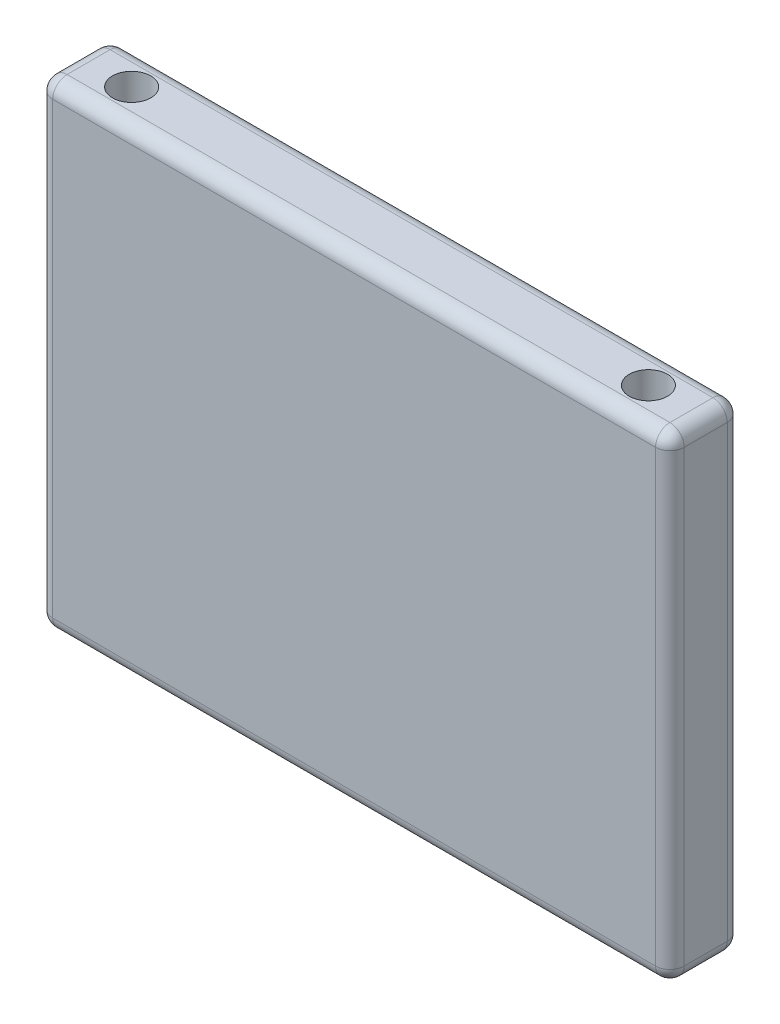
ISO-10303-21;
HEADER;
FILE_DESCRIPTION(('STEP AP214'),'2;1');
FILE_NAME('part.step','',(''),(''),'','','');
FILE_SCHEMA(('AUTOMOTIVE_DESIGN { 1 0 10303 214 1 1 1 1 }'));
ENDSEC;
DATA;
#1=APPLICATION_CONTEXT('core data for automotive mechanical design processes');
#2=APPLICATION_PROTOCOL_DEFINITION('international standard','automotive_design',2000,#1);
#3=PRODUCT_CONTEXT('',#1,'mechanical');
#4=PRODUCT('Part','Part','',(#3));
#5=PRODUCT_RELATED_PRODUCT_CATEGORY('part','',(#4));
#6=PRODUCT_DEFINITION_FORMATION('','',#4);
#7=PRODUCT_DEFINITION_CONTEXT('part definition',#1,'design');
#8=PRODUCT_DEFINITION('design','',#6,#7);
#9=PRODUCT_DEFINITION_SHAPE('','',#8);
#10=(LENGTH_UNIT() NAMED_UNIT(*) SI_UNIT(.MILLI.,.METRE.));
#11=(NAMED_UNIT(*) PLANE_ANGLE_UNIT() SI_UNIT($,.RADIAN.));
#12=(NAMED_UNIT(*) SI_UNIT($,.STERADIAN.) SOLID_ANGLE_UNIT());
#13=UNCERTAINTY_MEASURE_WITH_UNIT(LENGTH_MEASURE(1.E-05),#10,'distance_accuracy_value','');
#14=(GEOMETRIC_REPRESENTATION_CONTEXT(3) GLOBAL_UNCERTAINTY_ASSIGNED_CONTEXT((#13)) GLOBAL_UNIT_ASSIGNED_CONTEXT((#10,
#11,#12)) REPRESENTATION_CONTEXT('',''));
#15=CARTESIAN_POINT('',(0.,0.,0.));
#16=DIRECTION('',(0.,0.,1.));
#17=DIRECTION('',(1.,0.,0.));
#18=AXIS2_PLACEMENT_3D('',#15,#16,#17);
#19=CARTESIAN_POINT('',(66.0660660660661,50.,15.));
#20=DIRECTION('',(-1.,0.,0.));
#21=DIRECTION('',(0.,0.,1.));
#22=AXIS2_PLACEMENT_3D('',#19,#20,#21);
#23=PLANE('',#22);
#24=DIRECTION('',(0.,1.,0.));
#25=VECTOR('',#24,1.);
#26=CARTESIAN_POINT('',(66.0660660660661,50.,3.));
#27=LINE('',#26,#25);
#28=CARTESIAN_POINT('',(66.0660660660661,-47.,3.));
#29=VERTEX_POINT('',#28);
#30=CARTESIAN_POINT('',(66.0660660660661,47.,3.));
#31=VERTEX_POINT('',#30);
#32=EDGE_CURVE('E307',#29,#31,#27,.T.);
#33=ORIENTED_EDGE('',*,*,#32,.T.);
#34=DIRECTION('',(0.,0.,-1.));
#35=VECTOR('',#34,1.);
#36=CARTESIAN_POINT('',(66.0660660660661,47.,15.));
#37=LINE('',#36,#35);
#38=CARTESIAN_POINT('',(66.0660660660661,47.,12.));
#39=VERTEX_POINT('',#38);
#40=EDGE_CURVE('E310',#31,#39,#37,.F.);
#41=ORIENTED_EDGE('',*,*,#40,.T.);
#42=DIRECTION('',(0.,1.,0.));
#43=VECTOR('',#42,1.);
#44=CARTESIAN_POINT('',(66.0660660660661,-50.,12.));
#45=LINE('',#44,#43);
#46=CARTESIAN_POINT('',(66.0660660660661,-47.,12.));
#47=VERTEX_POINT('',#46);
#48=EDGE_CURVE('E301',#39,#47,#45,.F.);
#49=ORIENTED_EDGE('',*,*,#48,.T.);
#50=DIRECTION('',(0.,0.,-1.));
#51=VECTOR('',#50,1.);
#52=CARTESIAN_POINT('',(66.0660660660661,-47.,15.));
#53=LINE('',#52,#51);
#54=EDGE_CURVE('E304',#47,#29,#53,.T.);
#55=ORIENTED_EDGE('',*,*,#54,.T.);
#56=EDGE_LOOP('',(#33,#41,#49,#55));
#57=FACE_BOUND('',#56,.T.);
#58=ADVANCED_FACE('F38',(#57),#23,.F.);
#59=CARTESIAN_POINT('',(-66.0660660660661,50.,15.));
#60=DIRECTION('',(0.,-1.,0.));
#61=DIRECTION('',(0.,0.,-1.));
#62=AXIS2_PLACEMENT_3D('',#59,#60,#61);
#63=PLANE('',#62);
#64=DIRECTION('',(-1.,0.,0.));
#65=VECTOR('',#64,1.);
#66=CARTESIAN_POINT('',(-66.0660660660661,50.,3.));
#67=LINE('',#66,#65);
#68=CARTESIAN_POINT('',(63.0660660660661,50.,3.));
#69=VERTEX_POINT('',#68);
#70=CARTESIAN_POINT('',(-63.0660660660661,50.,3.));
#71=VERTEX_POINT('',#70);
#72=EDGE_CURVE('E269',#69,#71,#67,.T.);
#73=ORIENTED_EDGE('',*,*,#72,.T.);
#74=DIRECTION('',(0.,0.,-1.));
#75=VECTOR('',#74,1.);
#76=CARTESIAN_POINT('',(-63.0660660660661,50.,15.));
#77=LINE('',#76,#75);
#78=CARTESIAN_POINT('',(-63.0660660660661,50.,12.));
#79=VERTEX_POINT('',#78);
#80=EDGE_CURVE('E272',#71,#79,#77,.F.);
#81=ORIENTED_EDGE('',*,*,#80,.T.);
#82=DIRECTION('',(-1.,0.,0.));
#83=VECTOR('',#82,1.);
#84=CARTESIAN_POINT('',(66.0660660660661,50.,12.));
#85=LINE('',#84,#83);
#86=CARTESIAN_POINT('',(63.0660660660661,50.,12.));
#87=VERTEX_POINT('',#86);
#88=EDGE_CURVE('E266',#79,#87,#85,.F.);
#89=ORIENTED_EDGE('',*,*,#88,.T.);
#90=DIRECTION('',(0.,0.,-1.));
#91=VECTOR('',#90,1.);
#92=CARTESIAN_POINT('',(63.0660660660661,50.,15.));
#93=LINE('',#92,#91);
#94=EDGE_CURVE('E263',#87,#69,#93,.T.);
#95=ORIENTED_EDGE('',*,*,#94,.T.);
#96=EDGE_LOOP('',(#73,#81,#89,#95));
#97=FACE_BOUND('',#96,.T.);
#98=CARTESIAN_POINT('',(-54.0660660660661,50.,7.5));
#99=DIRECTION('',(0.,-1.,0.));
#100=DIRECTION('',(0.,0.,-1.));
#101=AXIS2_PLACEMENT_3D('',#98,#99,#100);
#102=CIRCLE('',#101,4.00000000000001);
#103=CARTESIAN_POINT('',(-54.0660660660661,50.,3.49999999999999));
#104=VERTEX_POINT('',#103);
#105=EDGE_CURVE('E239',#104,#104,#102,.T.);
#106=ORIENTED_EDGE('',*,*,#105,.T.);
#107=EDGE_LOOP('',(#106));
#108=FACE_BOUND('',#107,.T.);
#109=CARTESIAN_POINT('',(54.0660660660661,50.,7.5));
#110=DIRECTION('',(0.,-1.,0.));
#111=DIRECTION('',(0.,0.,1.));
#112=AXIS2_PLACEMENT_3D('',#109,#110,#111);
#113=CIRCLE('',#112,4.00000000000001);
#114=CARTESIAN_POINT('',(54.0660660660661,50.,11.5));
#115=VERTEX_POINT('',#114);
#116=EDGE_CURVE('E226',#115,#115,#113,.T.);
#117=ORIENTED_EDGE('',*,*,#116,.T.);
#118=EDGE_LOOP('',(#117));
#119=FACE_BOUND('',#118,.T.);
#120=ADVANCED_FACE('F353',(#97,#108,#119),#63,.F.);
#121=CARTESIAN_POINT('',(-66.0660660660661,50.,15.));
#122=DIRECTION('',(1.,0.,0.));
#123=DIRECTION('',(0.,0.,-1.));
#124=AXIS2_PLACEMENT_3D('',#121,#122,#123);
#125=PLANE('',#124);
#126=DIRECTION('',(0.,-1.,0.));
#127=VECTOR('',#126,1.);
#128=CARTESIAN_POINT('',(-66.0660660660661,50.,12.));
#129=LINE('',#128,#127);
#130=CARTESIAN_POINT('',(-66.0660660660661,-47.,12.));
#131=VERTEX_POINT('',#130);
#132=CARTESIAN_POINT('',(-66.0660660660661,47.,12.));
#133=VERTEX_POINT('',#132);
#134=EDGE_CURVE('E138',#131,#133,#129,.F.);
#135=ORIENTED_EDGE('',*,*,#134,.T.);
#136=DIRECTION('',(0.,0.,-1.));
#137=VECTOR('',#136,1.);
#138=CARTESIAN_POINT('',(-66.0660660660661,47.,15.));
#139=LINE('',#138,#137);
#140=CARTESIAN_POINT('',(-66.0660660660661,47.,3.));
#141=VERTEX_POINT('',#140);
#142=EDGE_CURVE('E133',#133,#141,#139,.T.);
#143=ORIENTED_EDGE('',*,*,#142,.T.);
#144=DIRECTION('',(0.,-1.,0.));
#145=VECTOR('',#144,1.);
#146=CARTESIAN_POINT('',(-66.0660660660661,50.,3.));
#147=LINE('',#146,#145);
#148=CARTESIAN_POINT('',(-66.0660660660661,-47.,3.));
#149=VERTEX_POINT('',#148);
#150=EDGE_CURVE('E127',#141,#149,#147,.T.);
#151=ORIENTED_EDGE('',*,*,#150,.T.);
#152=DIRECTION('',(0.,0.,-1.));
#153=VECTOR('',#152,1.);
#154=CARTESIAN_POINT('',(-66.0660660660661,-47.,15.));
#155=LINE('',#154,#153);
#156=EDGE_CURVE('E130',#149,#131,#155,.F.);
#157=ORIENTED_EDGE('',*,*,#156,.T.);
#158=EDGE_LOOP('',(#135,#143,#151,#157));
#159=FACE_BOUND('',#158,.T.);
#160=ADVANCED_FACE('F129',(#159),#125,.F.);
#161=CARTESIAN_POINT('',(-66.0660660660661,-50.,15.));
#162=DIRECTION('',(0.,1.,0.));
#163=DIRECTION('',(0.,0.,1.));
#164=AXIS2_PLACEMENT_3D('',#161,#162,#163);
#165=PLANE('',#164);
#166=DIRECTION('',(1.,0.,0.));
#167=VECTOR('',#166,1.);
#168=CARTESIAN_POINT('',(-66.0660660660661,-50.,3.));
#169=LINE('',#168,#167);
#170=CARTESIAN_POINT('',(-63.0660660660661,-50.,3.));
#171=VERTEX_POINT('',#170);
#172=CARTESIAN_POINT('',(63.0660660660661,-50.,3.));
#173=VERTEX_POINT('',#172);
#174=EDGE_CURVE('E48',#171,#173,#169,.T.);
#175=ORIENTED_EDGE('',*,*,#174,.T.);
#176=DIRECTION('',(0.,0.,-1.));
#177=VECTOR('',#176,1.);
#178=CARTESIAN_POINT('',(63.0660660660661,-50.,15.));
#179=LINE('',#178,#177);
#180=CARTESIAN_POINT('',(63.0660660660661,-50.,12.));
#181=VERTEX_POINT('',#180);
#182=EDGE_CURVE('E11',#173,#181,#179,.F.);
#183=ORIENTED_EDGE('',*,*,#182,.T.);
#184=DIRECTION('',(1.,0.,0.));
#185=VECTOR('',#184,1.);
#186=CARTESIAN_POINT('',(-66.0660660660661,-50.,12.));
#187=LINE('',#186,#185);
#188=CARTESIAN_POINT('',(-63.0660660660661,-50.,12.));
#189=VERTEX_POINT('',#188);
#190=EDGE_CURVE('E314',#181,#189,#187,.F.);
#191=ORIENTED_EDGE('',*,*,#190,.T.);
#192=DIRECTION('',(0.,0.,-1.));
#193=VECTOR('',#192,1.);
#194=CARTESIAN_POINT('',(-63.0660660660661,-50.,15.));
#195=LINE('',#194,#193);
#196=EDGE_CURVE('E59',#189,#171,#195,.T.);
#197=ORIENTED_EDGE('',*,*,#196,.T.);
#198=EDGE_LOOP('',(#175,#183,#191,#197));
#199=FACE_BOUND('',#198,.T.);
#200=CARTESIAN_POINT('',(-54.0660660660661,-50.,7.5));
#201=DIRECTION('',(0.,-1.,0.));
#202=DIRECTION('',(0.,0.,-1.));
#203=AXIS2_PLACEMENT_3D('',#200,#201,#202);
#204=CIRCLE('',#203,4.00000000000001);
#205=CARTESIAN_POINT('',(-54.0660660660661,-50.,3.49999999999999));
#206=VERTEX_POINT('',#205);
#207=EDGE_CURVE('E246',#206,#206,#204,.T.);
#208=ORIENTED_EDGE('',*,*,#207,.F.);
#209=EDGE_LOOP('',(#208));
#210=FACE_BOUND('',#209,.T.);
#211=CARTESIAN_POINT('',(54.0660660660661,-50.,7.5));
#212=DIRECTION('',(0.,-1.,0.));
#213=DIRECTION('',(0.,0.,1.));
#214=AXIS2_PLACEMENT_3D('',#211,#212,#213);
#215=CIRCLE('',#214,4.00000000000001);
#216=CARTESIAN_POINT('',(54.0660660660661,-50.,11.5));
#217=VERTEX_POINT('',#216);
#218=EDGE_CURVE('E254',#217,#217,#215,.T.);
#219=ORIENTED_EDGE('',*,*,#218,.F.);
#220=EDGE_LOOP('',(#219));
#221=FACE_BOUND('',#220,.T.);
#222=ADVANCED_FACE('F391',(#199,#210,#221),#165,.F.);
#223=CARTESIAN_POINT('',(0.,0.,15.));
#224=DIRECTION('',(0.,0.,1.));
#225=DIRECTION('',(1.,0.,0.));
#226=AXIS2_PLACEMENT_3D('',#223,#224,#225);
#227=PLANE('',#226);
#228=DIRECTION('',(0.,1.,0.));
#229=VECTOR('',#228,1.);
#230=CARTESIAN_POINT('',(63.0660660660661,50.,15.));
#231=LINE('',#230,#229);
#232=CARTESIAN_POINT('',(63.0660660660661,-47.,15.));
#233=VERTEX_POINT('',#232);
#234=CARTESIAN_POINT('',(63.0660660660661,47.,15.));
#235=VERTEX_POINT('',#234);
#236=EDGE_CURVE('E294',#233,#235,#231,.T.);
#237=ORIENTED_EDGE('',*,*,#236,.T.);
#238=DIRECTION('',(-1.,0.,0.));
#239=VECTOR('',#238,1.);
#240=CARTESIAN_POINT('',(-66.0660660660661,47.,15.));
#241=LINE('',#240,#239);
#242=CARTESIAN_POINT('',(-63.0660660660661,47.,15.));
#243=VERTEX_POINT('',#242);
#244=EDGE_CURVE('E297',#235,#243,#241,.T.);
#245=ORIENTED_EDGE('',*,*,#244,.T.);
#246=DIRECTION('',(0.,-1.,0.));
#247=VECTOR('',#246,1.);
#248=CARTESIAN_POINT('',(-63.0660660660661,-50.,15.));
#249=LINE('',#248,#247);
#250=CARTESIAN_POINT('',(-63.0660660660661,-47.,15.));
#251=VERTEX_POINT('',#250);
#252=EDGE_CURVE('E291',#243,#251,#249,.T.);
#253=ORIENTED_EDGE('',*,*,#252,.T.);
#254=DIRECTION('',(1.,0.,0.));
#255=VECTOR('',#254,1.);
#256=CARTESIAN_POINT('',(66.0660660660661,-47.,15.));
#257=LINE('',#256,#255);
#258=EDGE_CURVE('E288',#251,#233,#257,.T.);
#259=ORIENTED_EDGE('',*,*,#258,.T.);
#260=EDGE_LOOP('',(#237,#245,#253,#259));
#261=FACE_BOUND('',#260,.T.);
#262=ADVANCED_FACE('F403',(#261),#227,.T.);
#263=CARTESIAN_POINT('',(0.,0.,0.));
#264=DIRECTION('',(0.,0.,1.));
#265=DIRECTION('',(1.,0.,0.));
#266=AXIS2_PLACEMENT_3D('',#263,#264,#265);
#267=PLANE('',#266);
#268=DIRECTION('',(0.,-1.,0.));
#269=VECTOR('',#268,1.);
#270=CARTESIAN_POINT('',(-63.0660660660661,0.,0.));
#271=LINE('',#270,#269);
#272=CARTESIAN_POINT('',(-63.0660660660661,-47.,0.));
#273=VERTEX_POINT('',#272);
#274=CARTESIAN_POINT('',(-63.0660660660661,47.,0.));
#275=VERTEX_POINT('',#274);
#276=EDGE_CURVE('E162',#273,#275,#271,.F.);
#277=ORIENTED_EDGE('',*,*,#276,.T.);
#278=DIRECTION('',(-1.,0.,0.));
#279=VECTOR('',#278,1.);
#280=CARTESIAN_POINT('',(0.,47.,0.));
#281=LINE('',#280,#279);
#282=CARTESIAN_POINT('',(63.0660660660661,47.,0.));
#283=VERTEX_POINT('',#282);
#284=EDGE_CURVE('E284',#275,#283,#281,.F.);
#285=ORIENTED_EDGE('',*,*,#284,.T.);
#286=DIRECTION('',(0.,1.,0.));
#287=VECTOR('',#286,1.);
#288=CARTESIAN_POINT('',(63.0660660660661,0.,0.));
#289=LINE('',#288,#287);
#290=CARTESIAN_POINT('',(63.0660660660661,-47.,0.));
#291=VERTEX_POINT('',#290);
#292=EDGE_CURVE('E281',#283,#291,#289,.F.);
#293=ORIENTED_EDGE('',*,*,#292,.T.);
#294=DIRECTION('',(1.,0.,0.));
#295=VECTOR('',#294,1.);
#296=CARTESIAN_POINT('',(0.,-47.,0.));
#297=LINE('',#296,#295);
#298=EDGE_CURVE('E278',#291,#273,#297,.F.);
#299=ORIENTED_EDGE('',*,*,#298,.T.);
#300=EDGE_LOOP('',(#277,#285,#293,#299));
#301=FACE_BOUND('',#300,.T.);
#302=ADVANCED_FACE('F367',(#301),#267,.F.);
#303=CARTESIAN_POINT('',(54.0660660660661,-30.,7.5));
#304=DIRECTION('',(0.,-1.,0.));
#305=DIRECTION('',(0.,0.,-1.));
#306=AXIS2_PLACEMENT_3D('',#303,#304,#305);
#307=CYLINDRICAL_SURFACE('',#306,4.00000000000001);
#308=CARTESIAN_POINT('',(54.0660660660661,-30.,7.5));
#309=DIRECTION('',(0.,-1.,0.));
#310=DIRECTION('',(0.,0.,1.));
#311=AXIS2_PLACEMENT_3D('',#308,#309,#310);
#312=CIRCLE('',#311,4.00000000000001);
#313=CARTESIAN_POINT('',(54.0660660660661,-30.,11.5));
#314=VERTEX_POINT('',#313);
#315=EDGE_CURVE('E250',#314,#314,#312,.T.);
#316=ORIENTED_EDGE('',*,*,#315,.F.);
#317=EDGE_LOOP('',(#316));
#318=FACE_BOUND('',#317,.T.);
#319=ORIENTED_EDGE('',*,*,#218,.T.);
#320=EDGE_LOOP('',(#319));
#321=FACE_BOUND('',#320,.T.);
#322=ADVANCED_FACE('F634',(#318,#321),#307,.F.);
#323=CARTESIAN_POINT('',(54.0660660660661,-30.,7.5));
#324=DIRECTION('',(0.,1.,0.));
#325=DIRECTION('',(0.,0.,1.));
#326=AXIS2_PLACEMENT_3D('',#323,#324,#325);
#327=PLANE('',#326);
#328=ORIENTED_EDGE('',*,*,#315,.T.);
#329=EDGE_LOOP('',(#328));
#330=FACE_BOUND('',#329,.T.);
#331=ADVANCED_FACE('F625',(#330),#327,.F.);
#332=CARTESIAN_POINT('',(-54.0660660660661,-30.,7.5));
#333=DIRECTION('',(0.,-1.,0.));
#334=DIRECTION('',(0.,0.,-1.));
#335=AXIS2_PLACEMENT_3D('',#332,#333,#334);
#336=CYLINDRICAL_SURFACE('',#335,4.00000000000001);
#337=CARTESIAN_POINT('',(-54.0660660660661,-30.,7.5));
#338=DIRECTION('',(0.,-1.,0.));
#339=DIRECTION('',(0.,0.,-1.));
#340=AXIS2_PLACEMENT_3D('',#337,#338,#339);
#341=CIRCLE('',#340,4.00000000000001);
#342=CARTESIAN_POINT('',(-54.0660660660661,-30.,3.49999999999999));
#343=VERTEX_POINT('',#342);
#344=EDGE_CURVE('E150',#343,#343,#341,.T.);
#345=ORIENTED_EDGE('',*,*,#344,.F.);
#346=EDGE_LOOP('',(#345));
#347=FACE_BOUND('',#346,.T.);
#348=ORIENTED_EDGE('',*,*,#207,.T.);
#349=EDGE_LOOP('',(#348));
#350=FACE_BOUND('',#349,.T.);
#351=ADVANCED_FACE('F616',(#347,#350),#336,.F.);
#352=CARTESIAN_POINT('',(-54.0660660660661,-30.,7.5));
#353=DIRECTION('',(0.,-1.,0.));
#354=DIRECTION('',(0.,0.,-1.));
#355=AXIS2_PLACEMENT_3D('',#352,#353,#354);
#356=PLANE('',#355);
#357=ORIENTED_EDGE('',*,*,#344,.T.);
#358=EDGE_LOOP('',(#357));
#359=FACE_BOUND('',#358,.T.);
#360=ADVANCED_FACE('F607',(#359),#356,.T.);
#361=CARTESIAN_POINT('',(54.0660660660661,30.,7.5));
#362=DIRECTION('',(0.,1.,0.));
#363=DIRECTION('',(0.,0.,1.));
#364=AXIS2_PLACEMENT_3D('',#361,#362,#363);
#365=CYLINDRICAL_SURFACE('',#364,4.00000000000001);
#366=CARTESIAN_POINT('',(54.0660660660661,30.,7.5));
#367=DIRECTION('',(0.,-1.,0.));
#368=DIRECTION('',(0.,0.,1.));
#369=AXIS2_PLACEMENT_3D('',#366,#367,#368);
#370=CIRCLE('',#369,4.00000000000001);
#371=CARTESIAN_POINT('',(54.0660660660661,30.,11.5));
#372=VERTEX_POINT('',#371);
#373=EDGE_CURVE('E233',#372,#372,#370,.T.);
#374=ORIENTED_EDGE('',*,*,#373,.T.);
#375=EDGE_LOOP('',(#374));
#376=FACE_BOUND('',#375,.T.);
#377=ORIENTED_EDGE('',*,*,#116,.F.);
#378=EDGE_LOOP('',(#377));
#379=FACE_BOUND('',#378,.T.);
#380=ADVANCED_FACE('F598',(#376,#379),#365,.F.);
#381=CARTESIAN_POINT('',(54.0660660660661,30.,7.5));
#382=DIRECTION('',(0.,-1.,0.));
#383=DIRECTION('',(0.,0.,1.));
#384=AXIS2_PLACEMENT_3D('',#381,#382,#383);
#385=PLANE('',#384);
#386=ORIENTED_EDGE('',*,*,#373,.F.);
#387=EDGE_LOOP('',(#386));
#388=FACE_BOUND('',#387,.T.);
#389=ADVANCED_FACE('F589',(#388),#385,.F.);
#390=CARTESIAN_POINT('',(-54.0660660660661,30.,7.5));
#391=DIRECTION('',(0.,1.,0.));
#392=DIRECTION('',(0.,0.,1.));
#393=AXIS2_PLACEMENT_3D('',#390,#391,#392);
#394=CYLINDRICAL_SURFACE('',#393,4.00000000000001);
#395=CARTESIAN_POINT('',(-54.0660660660661,30.,7.5));
#396=DIRECTION('',(0.,-1.,0.));
#397=DIRECTION('',(0.,0.,-1.));
#398=AXIS2_PLACEMENT_3D('',#395,#396,#397);
#399=CIRCLE('',#398,4.00000000000001);
#400=CARTESIAN_POINT('',(-54.0660660660661,30.,3.49999999999999));
#401=VERTEX_POINT('',#400);
#402=EDGE_CURVE('E257',#401,#401,#399,.T.);
#403=ORIENTED_EDGE('',*,*,#402,.T.);
#404=EDGE_LOOP('',(#403));
#405=FACE_BOUND('',#404,.T.);
#406=ORIENTED_EDGE('',*,*,#105,.F.);
#407=EDGE_LOOP('',(#406));
#408=FACE_BOUND('',#407,.T.);
#409=ADVANCED_FACE('F580',(#405,#408),#394,.F.);
#410=CARTESIAN_POINT('',(-54.0660660660661,30.,7.5));
#411=DIRECTION('',(0.,1.,0.));
#412=DIRECTION('',(0.,0.,-1.));
#413=AXIS2_PLACEMENT_3D('',#410,#411,#412);
#414=PLANE('',#413);
#415=ORIENTED_EDGE('',*,*,#402,.F.);
#416=EDGE_LOOP('',(#415));
#417=FACE_BOUND('',#416,.T.);
#418=ADVANCED_FACE('F411',(#417),#414,.T.);
#419=CARTESIAN_POINT('',(63.0660660660661,-47.,15.));
#420=DIRECTION('',(0.,0.,-1.));
#421=DIRECTION('',(-1.,0.,0.));
#422=AXIS2_PLACEMENT_3D('',#419,#420,#421);
#423=CYLINDRICAL_SURFACE('',#422,3.);
#424=CARTESIAN_POINT('',(63.0660660660661,-47.,12.));
#425=DIRECTION('',(0.,0.,1.));
#426=DIRECTION('',(1.,0.,0.));
#427=AXIS2_PLACEMENT_3D('',#424,#425,#426);
#428=CIRCLE('',#427,3.);
#429=EDGE_CURVE('E42',#181,#47,#428,.T.);
#430=ORIENTED_EDGE('',*,*,#429,.F.);
#431=ORIENTED_EDGE('',*,*,#182,.F.);
#432=CARTESIAN_POINT('',(63.0660660660661,-47.,3.));
#433=DIRECTION('',(0.,0.,-1.));
#434=DIRECTION('',(-1.,0.,0.));
#435=AXIS2_PLACEMENT_3D('',#432,#433,#434);
#436=CIRCLE('',#435,3.);
#437=EDGE_CURVE('E217',#29,#173,#436,.T.);
#438=ORIENTED_EDGE('',*,*,#437,.F.);
#439=ORIENTED_EDGE('',*,*,#54,.F.);
#440=EDGE_LOOP('',(#430,#431,#438,#439));
#441=FACE_BOUND('',#440,.T.);
#442=ADVANCED_FACE('F40',(#441),#423,.T.);
#443=CARTESIAN_POINT('',(63.0660660660661,-47.,12.));
#444=DIRECTION('',(1.,0.,0.));
#445=DIRECTION('',(0.,0.,-1.));
#446=AXIS2_PLACEMENT_3D('',#443,#444,#445);
#447=SPHERICAL_SURFACE('',#446,3.);
#448=CARTESIAN_POINT('',(63.0660660660661,-47.,12.));
#449=DIRECTION('',(1.,0.,0.));
#450=DIRECTION('',(0.,0.,-1.));
#451=AXIS2_PLACEMENT_3D('',#448,#449,#450);
#452=CIRCLE('',#451,3.);
#453=EDGE_CURVE('E210',#181,#233,#452,.F.);
#454=ORIENTED_EDGE('',*,*,#453,.F.);
#455=ORIENTED_EDGE('',*,*,#429,.T.);
#456=CARTESIAN_POINT('',(63.0660660660661,-47.,12.));
#457=DIRECTION('',(0.,-1.,0.));
#458=DIRECTION('',(0.,0.,-1.));
#459=AXIS2_PLACEMENT_3D('',#456,#457,#458);
#460=CIRCLE('',#459,3.);
#461=EDGE_CURVE('E214',#233,#47,#460,.F.);
#462=ORIENTED_EDGE('',*,*,#461,.F.);
#463=EDGE_LOOP('',(#454,#455,#462));
#464=FACE_BOUND('',#463,.T.);
#465=ADVANCED_FACE('F404',(#464),#447,.T.);
#466=CARTESIAN_POINT('',(63.0660660660661,-47.,3.));
#467=DIRECTION('',(0.,-1.,0.));
#468=DIRECTION('',(0.,0.,-1.));
#469=AXIS2_PLACEMENT_3D('',#466,#467,#468);
#470=SPHERICAL_SURFACE('',#469,3.);
#471=CARTESIAN_POINT('',(63.0660660660661,-47.,3.));
#472=DIRECTION('',(0.,-1.,0.));
#473=DIRECTION('',(0.,0.,-1.));
#474=AXIS2_PLACEMENT_3D('',#471,#472,#473);
#475=CIRCLE('',#474,3.);
#476=EDGE_CURVE('E202',#29,#291,#475,.F.);
#477=ORIENTED_EDGE('',*,*,#476,.F.);
#478=ORIENTED_EDGE('',*,*,#437,.T.);
#479=CARTESIAN_POINT('',(63.0660660660661,-47.,3.));
#480=DIRECTION('',(1.,0.,0.));
#481=DIRECTION('',(0.,0.,-1.));
#482=AXIS2_PLACEMENT_3D('',#479,#480,#481);
#483=CIRCLE('',#482,3.);
#484=EDGE_CURVE('E206',#291,#173,#483,.F.);
#485=ORIENTED_EDGE('',*,*,#484,.F.);
#486=EDGE_LOOP('',(#477,#478,#485));
#487=FACE_BOUND('',#486,.T.);
#488=ADVANCED_FACE('F372',(#487),#470,.T.);
#489=CARTESIAN_POINT('',(63.0660660660661,0.,12.));
#490=DIRECTION('',(0.,-1.,0.));
#491=DIRECTION('',(0.,0.,-1.));
#492=AXIS2_PLACEMENT_3D('',#489,#490,#491);
#493=CYLINDRICAL_SURFACE('',#492,3.);
#494=ORIENTED_EDGE('',*,*,#461,.T.);
#495=ORIENTED_EDGE('',*,*,#48,.F.);
#496=CARTESIAN_POINT('',(63.0660660660661,47.,12.));
#497=DIRECTION('',(0.,1.,0.));
#498=DIRECTION('',(0.,0.,1.));
#499=AXIS2_PLACEMENT_3D('',#496,#497,#498);
#500=CIRCLE('',#499,3.);
#501=EDGE_CURVE('E195',#235,#39,#500,.T.);
#502=ORIENTED_EDGE('',*,*,#501,.F.);
#503=ORIENTED_EDGE('',*,*,#236,.F.);
#504=EDGE_LOOP('',(#494,#495,#502,#503));
#505=FACE_BOUND('',#504,.T.);
#506=ADVANCED_FACE('F388',(#505),#493,.T.);
#507=CARTESIAN_POINT('',(0.,-47.,12.));
#508=DIRECTION('',(-1.,0.,0.));
#509=DIRECTION('',(0.,0.,1.));
#510=AXIS2_PLACEMENT_3D('',#507,#508,#509);
#511=CYLINDRICAL_SURFACE('',#510,3.);
#512=ORIENTED_EDGE('',*,*,#453,.T.);
#513=ORIENTED_EDGE('',*,*,#258,.F.);
#514=CARTESIAN_POINT('',(-63.0660660660661,-47.,12.));
#515=DIRECTION('',(-1.,0.,0.));
#516=DIRECTION('',(0.,0.,1.));
#517=AXIS2_PLACEMENT_3D('',#514,#515,#516);
#518=CIRCLE('',#517,3.);
#519=EDGE_CURVE('E191',#189,#251,#518,.T.);
#520=ORIENTED_EDGE('',*,*,#519,.F.);
#521=ORIENTED_EDGE('',*,*,#190,.F.);
#522=EDGE_LOOP('',(#512,#513,#520,#521));
#523=FACE_BOUND('',#522,.T.);
#524=ADVANCED_FACE('F396',(#523),#511,.T.);
#525=CARTESIAN_POINT('',(-63.0660660660661,-47.,15.));
#526=DIRECTION('',(0.,0.,-1.));
#527=DIRECTION('',(-1.,0.,0.));
#528=AXIS2_PLACEMENT_3D('',#525,#526,#527);
#529=CYLINDRICAL_SURFACE('',#528,3.);
#530=CARTESIAN_POINT('',(-63.0660660660661,-47.,3.));
#531=DIRECTION('',(0.,0.,-1.));
#532=DIRECTION('',(-1.,0.,0.));
#533=AXIS2_PLACEMENT_3D('',#530,#531,#532);
#534=CIRCLE('',#533,3.);
#535=EDGE_CURVE('E144',#171,#149,#534,.T.);
#536=ORIENTED_EDGE('',*,*,#535,.F.);
#537=ORIENTED_EDGE('',*,*,#196,.F.);
#538=CARTESIAN_POINT('',(-63.0660660660661,-47.,12.));
#539=DIRECTION('',(0.,0.,1.));
#540=DIRECTION('',(1.,0.,0.));
#541=AXIS2_PLACEMENT_3D('',#538,#539,#540);
#542=CIRCLE('',#541,3.);
#543=EDGE_CURVE('E147',#131,#189,#542,.T.);
#544=ORIENTED_EDGE('',*,*,#543,.F.);
#545=ORIENTED_EDGE('',*,*,#156,.F.);
#546=EDGE_LOOP('',(#536,#537,#544,#545));
#547=FACE_BOUND('',#546,.T.);
#548=ADVANCED_FACE('F143',(#547),#529,.T.);
#549=CARTESIAN_POINT('',(-66.0660660660661,-47.,3.));
#550=DIRECTION('',(1.,0.,0.));
#551=DIRECTION('',(0.,0.,-1.));
#552=AXIS2_PLACEMENT_3D('',#549,#550,#551);
#553=CYLINDRICAL_SURFACE('',#552,3.);
#554=ORIENTED_EDGE('',*,*,#484,.T.);
#555=ORIENTED_EDGE('',*,*,#174,.F.);
#556=CARTESIAN_POINT('',(-63.0660660660661,-47.,3.));
#557=DIRECTION('',(-1.,0.,0.));
#558=DIRECTION('',(0.,0.,1.));
#559=AXIS2_PLACEMENT_3D('',#556,#557,#558);
#560=CIRCLE('',#559,3.);
#561=EDGE_CURVE('E158',#273,#171,#560,.T.);
#562=ORIENTED_EDGE('',*,*,#561,.F.);
#563=ORIENTED_EDGE('',*,*,#298,.F.);
#564=EDGE_LOOP('',(#554,#555,#562,#563));
#565=FACE_BOUND('',#564,.T.);
#566=ADVANCED_FACE('F371',(#565),#553,.T.);
#567=CARTESIAN_POINT('',(63.0660660660661,50.,3.));
#568=DIRECTION('',(0.,1.,0.));
#569=DIRECTION('',(0.,0.,1.));
#570=AXIS2_PLACEMENT_3D('',#567,#568,#569);
#571=CYLINDRICAL_SURFACE('',#570,3.);
#572=ORIENTED_EDGE('',*,*,#476,.T.);
#573=ORIENTED_EDGE('',*,*,#292,.F.);
#574=CARTESIAN_POINT('',(63.0660660660661,47.,3.));
#575=DIRECTION('',(0.,1.,0.));
#576=DIRECTION('',(0.,0.,1.));
#577=AXIS2_PLACEMENT_3D('',#574,#575,#576);
#578=CIRCLE('',#577,3.);
#579=EDGE_CURVE('E183',#31,#283,#578,.T.);
#580=ORIENTED_EDGE('',*,*,#579,.F.);
#581=ORIENTED_EDGE('',*,*,#32,.F.);
#582=EDGE_LOOP('',(#572,#573,#580,#581));
#583=FACE_BOUND('',#582,.T.);
#584=ADVANCED_FACE('F376',(#583),#571,.T.);
#585=CARTESIAN_POINT('',(63.0660660660661,47.,15.));
#586=DIRECTION('',(0.,0.,-1.));
#587=DIRECTION('',(-1.,0.,0.));
#588=AXIS2_PLACEMENT_3D('',#585,#586,#587);
#589=CYLINDRICAL_SURFACE('',#588,3.);
#590=CARTESIAN_POINT('',(63.0660660660661,47.,12.));
#591=DIRECTION('',(0.,0.,1.));
#592=DIRECTION('',(1.,0.,0.));
#593=AXIS2_PLACEMENT_3D('',#590,#591,#592);
#594=CIRCLE('',#593,3.);
#595=EDGE_CURVE('E198',#39,#87,#594,.T.);
#596=ORIENTED_EDGE('',*,*,#595,.F.);
#597=ORIENTED_EDGE('',*,*,#40,.F.);
#598=CARTESIAN_POINT('',(63.0660660660661,47.,3.));
#599=DIRECTION('',(0.,0.,-1.));
#600=DIRECTION('',(-1.,0.,0.));
#601=AXIS2_PLACEMENT_3D('',#598,#599,#600);
#602=CIRCLE('',#601,3.);
#603=EDGE_CURVE('E179',#69,#31,#602,.T.);
#604=ORIENTED_EDGE('',*,*,#603,.F.);
#605=ORIENTED_EDGE('',*,*,#94,.F.);
#606=EDGE_LOOP('',(#596,#597,#604,#605));
#607=FACE_BOUND('',#606,.T.);
#608=ADVANCED_FACE('F383',(#607),#589,.T.);
#609=CARTESIAN_POINT('',(63.0660660660661,47.,12.));
#610=DIRECTION('',(1.,0.,0.));
#611=DIRECTION('',(0.,0.,-1.));
#612=AXIS2_PLACEMENT_3D('',#609,#610,#611);
#613=SPHERICAL_SURFACE('',#612,3.);
#614=ORIENTED_EDGE('',*,*,#501,.T.);
#615=ORIENTED_EDGE('',*,*,#595,.T.);
#616=CARTESIAN_POINT('',(63.0660660660661,47.,12.));
#617=DIRECTION('',(1.,0.,0.));
#618=DIRECTION('',(0.,0.,-1.));
#619=AXIS2_PLACEMENT_3D('',#616,#617,#618);
#620=CIRCLE('',#619,3.);
#621=EDGE_CURVE('E170',#235,#87,#620,.F.);
#622=ORIENTED_EDGE('',*,*,#621,.F.);
#623=EDGE_LOOP('',(#614,#615,#622));
#624=FACE_BOUND('',#623,.T.);
#625=ADVANCED_FACE('F443',(#624),#613,.T.);
#626=CARTESIAN_POINT('',(-63.0660660660661,-47.,12.));
#627=DIRECTION('',(0.,-1.,0.));
#628=DIRECTION('',(0.,0.,-1.));
#629=AXIS2_PLACEMENT_3D('',#626,#627,#628);
#630=SPHERICAL_SURFACE('',#629,3.);
#631=ORIENTED_EDGE('',*,*,#543,.T.);
#632=ORIENTED_EDGE('',*,*,#519,.T.);
#633=CARTESIAN_POINT('',(-63.0660660660661,-47.,12.));
#634=DIRECTION('',(0.,-1.,0.));
#635=DIRECTION('',(0.,0.,-1.));
#636=AXIS2_PLACEMENT_3D('',#633,#634,#635);
#637=CIRCLE('',#636,3.);
#638=EDGE_CURVE('E164',#131,#251,#637,.F.);
#639=ORIENTED_EDGE('',*,*,#638,.F.);
#640=EDGE_LOOP('',(#631,#632,#639));
#641=FACE_BOUND('',#640,.T.);
#642=ADVANCED_FACE('F398',(#641),#630,.T.);
#643=CARTESIAN_POINT('',(-63.0660660660661,-47.,3.));
#644=DIRECTION('',(0.,-1.,0.));
#645=DIRECTION('',(0.,0.,-1.));
#646=AXIS2_PLACEMENT_3D('',#643,#644,#645);
#647=SPHERICAL_SURFACE('',#646,3.);
#648=ORIENTED_EDGE('',*,*,#561,.T.);
#649=ORIENTED_EDGE('',*,*,#535,.T.);
#650=CARTESIAN_POINT('',(-63.0660660660661,-47.,3.));
#651=DIRECTION('',(0.,-1.,0.));
#652=DIRECTION('',(0.,0.,-1.));
#653=AXIS2_PLACEMENT_3D('',#650,#651,#652);
#654=CIRCLE('',#653,3.);
#655=EDGE_CURVE('E155',#273,#149,#654,.F.);
#656=ORIENTED_EDGE('',*,*,#655,.F.);
#657=EDGE_LOOP('',(#648,#649,#656));
#658=FACE_BOUND('',#657,.T.);
#659=ADVANCED_FACE('F154',(#658),#647,.T.);
#660=CARTESIAN_POINT('',(63.0660660660661,47.,3.));
#661=DIRECTION('',(1.,0.,0.));
#662=DIRECTION('',(0.,0.,-1.));
#663=AXIS2_PLACEMENT_3D('',#660,#661,#662);
#664=SPHERICAL_SURFACE('',#663,3.);
#665=ORIENTED_EDGE('',*,*,#603,.T.);
#666=ORIENTED_EDGE('',*,*,#579,.T.);
#667=CARTESIAN_POINT('',(63.0660660660661,47.,3.));
#668=DIRECTION('',(1.,0.,0.));
#669=DIRECTION('',(0.,0.,-1.));
#670=AXIS2_PLACEMENT_3D('',#667,#668,#669);
#671=CIRCLE('',#670,3.);
#672=EDGE_CURVE('E165',#69,#283,#671,.F.);
#673=ORIENTED_EDGE('',*,*,#672,.F.);
#674=EDGE_LOOP('',(#665,#666,#673));
#675=FACE_BOUND('',#674,.T.);
#676=ADVANCED_FACE('F435',(#675),#664,.T.);
#677=CARTESIAN_POINT('',(0.,47.,12.));
#678=DIRECTION('',(1.,0.,0.));
#679=DIRECTION('',(0.,0.,-1.));
#680=AXIS2_PLACEMENT_3D('',#677,#678,#679);
#681=CYLINDRICAL_SURFACE('',#680,3.);
#682=ORIENTED_EDGE('',*,*,#621,.T.);
#683=ORIENTED_EDGE('',*,*,#88,.F.);
#684=CARTESIAN_POINT('',(-63.0660660660661,47.,12.));
#685=DIRECTION('',(-1.,0.,0.));
#686=DIRECTION('',(0.,0.,1.));
#687=AXIS2_PLACEMENT_3D('',#684,#685,#686);
#688=CIRCLE('',#687,3.);
#689=EDGE_CURVE('E172',#243,#79,#688,.T.);
#690=ORIENTED_EDGE('',*,*,#689,.F.);
#691=ORIENTED_EDGE('',*,*,#244,.F.);
#692=EDGE_LOOP('',(#682,#683,#690,#691));
#693=FACE_BOUND('',#692,.T.);
#694=ADVANCED_FACE('F348',(#693),#681,.T.);
#695=CARTESIAN_POINT('',(-63.0660660660661,0.,12.));
#696=DIRECTION('',(0.,1.,0.));
#697=DIRECTION('',(0.,0.,1.));
#698=AXIS2_PLACEMENT_3D('',#695,#696,#697);
#699=CYLINDRICAL_SURFACE('',#698,3.);
#700=ORIENTED_EDGE('',*,*,#638,.T.);
#701=ORIENTED_EDGE('',*,*,#252,.F.);
#702=CARTESIAN_POINT('',(-63.0660660660661,47.,12.));
#703=DIRECTION('',(0.,1.,0.));
#704=DIRECTION('',(0.,0.,1.));
#705=AXIS2_PLACEMENT_3D('',#702,#703,#704);
#706=CIRCLE('',#705,3.);
#707=EDGE_CURVE('E335',#133,#243,#706,.T.);
#708=ORIENTED_EDGE('',*,*,#707,.F.);
#709=ORIENTED_EDGE('',*,*,#134,.F.);
#710=EDGE_LOOP('',(#700,#701,#708,#709));
#711=FACE_BOUND('',#710,.T.);
#712=ADVANCED_FACE('F401',(#711),#699,.T.);
#713=CARTESIAN_POINT('',(-63.0660660660661,50.,3.));
#714=DIRECTION('',(0.,-1.,0.));
#715=DIRECTION('',(0.,0.,-1.));
#716=AXIS2_PLACEMENT_3D('',#713,#714,#715);
#717=CYLINDRICAL_SURFACE('',#716,3.);
#718=ORIENTED_EDGE('',*,*,#655,.T.);
#719=ORIENTED_EDGE('',*,*,#150,.F.);
#720=CARTESIAN_POINT('',(-63.0660660660661,47.,3.));
#721=DIRECTION('',(0.,1.,0.));
#722=DIRECTION('',(0.,0.,1.));
#723=AXIS2_PLACEMENT_3D('',#720,#721,#722);
#724=CIRCLE('',#723,3.);
#725=EDGE_CURVE('E331',#275,#141,#724,.T.);
#726=ORIENTED_EDGE('',*,*,#725,.F.);
#727=ORIENTED_EDGE('',*,*,#276,.F.);
#728=EDGE_LOOP('',(#718,#719,#726,#727));
#729=FACE_BOUND('',#728,.T.);
#730=ADVANCED_FACE('F161',(#729),#717,.T.);
#731=CARTESIAN_POINT('',(-66.0660660660661,47.,3.));
#732=DIRECTION('',(-1.,0.,0.));
#733=DIRECTION('',(0.,0.,1.));
#734=AXIS2_PLACEMENT_3D('',#731,#732,#733);
#735=CYLINDRICAL_SURFACE('',#734,3.);
#736=ORIENTED_EDGE('',*,*,#672,.T.);
#737=ORIENTED_EDGE('',*,*,#284,.F.);
#738=CARTESIAN_POINT('',(-63.0660660660661,47.,3.));
#739=DIRECTION('',(-1.,0.,0.));
#740=DIRECTION('',(0.,0.,1.));
#741=AXIS2_PLACEMENT_3D('',#738,#739,#740);
#742=CIRCLE('',#741,3.);
#743=EDGE_CURVE('E327',#71,#275,#742,.T.);
#744=ORIENTED_EDGE('',*,*,#743,.F.);
#745=ORIENTED_EDGE('',*,*,#72,.F.);
#746=EDGE_LOOP('',(#736,#737,#744,#745));
#747=FACE_BOUND('',#746,.T.);
#748=ADVANCED_FACE('F364',(#747),#735,.T.);
#749=CARTESIAN_POINT('',(-63.0660660660661,47.,12.));
#750=DIRECTION('',(0.,0.,1.));
#751=DIRECTION('',(1.,0.,0.));
#752=AXIS2_PLACEMENT_3D('',#749,#750,#751);
#753=SPHERICAL_SURFACE('',#752,3.);
#754=ORIENTED_EDGE('',*,*,#707,.T.);
#755=ORIENTED_EDGE('',*,*,#689,.T.);
#756=CARTESIAN_POINT('',(-63.0660660660661,47.,12.));
#757=DIRECTION('',(0.,0.,1.));
#758=DIRECTION('',(1.,0.,0.));
#759=AXIS2_PLACEMENT_3D('',#756,#757,#758);
#760=CIRCLE('',#759,3.);
#761=EDGE_CURVE('E324',#133,#79,#760,.F.);
#762=ORIENTED_EDGE('',*,*,#761,.F.);
#763=EDGE_LOOP('',(#754,#755,#762));
#764=FACE_BOUND('',#763,.T.);
#765=ADVANCED_FACE('F343',(#764),#753,.T.);
#766=CARTESIAN_POINT('',(-63.0660660660661,47.,3.));
#767=DIRECTION('',(0.,0.,-1.));
#768=DIRECTION('',(-1.,0.,0.));
#769=AXIS2_PLACEMENT_3D('',#766,#767,#768);
#770=SPHERICAL_SURFACE('',#769,3.);
#771=ORIENTED_EDGE('',*,*,#743,.T.);
#772=ORIENTED_EDGE('',*,*,#725,.T.);
#773=CARTESIAN_POINT('',(-63.0660660660661,47.,3.));
#774=DIRECTION('',(0.,0.,-1.));
#775=DIRECTION('',(-1.,0.,0.));
#776=AXIS2_PLACEMENT_3D('',#773,#774,#775);
#777=CIRCLE('',#776,3.);
#778=EDGE_CURVE('E321',#71,#141,#777,.F.);
#779=ORIENTED_EDGE('',*,*,#778,.F.);
#780=EDGE_LOOP('',(#771,#772,#779));
#781=FACE_BOUND('',#780,.T.);
#782=ADVANCED_FACE('F361',(#781),#770,.T.);
#783=CARTESIAN_POINT('',(-63.0660660660661,47.,15.));
#784=DIRECTION('',(0.,0.,-1.));
#785=DIRECTION('',(-1.,0.,0.));
#786=AXIS2_PLACEMENT_3D('',#783,#784,#785);
#787=CYLINDRICAL_SURFACE('',#786,3.);
#788=ORIENTED_EDGE('',*,*,#761,.T.);
#789=ORIENTED_EDGE('',*,*,#80,.F.);
#790=ORIENTED_EDGE('',*,*,#778,.T.);
#791=ORIENTED_EDGE('',*,*,#142,.F.);
#792=EDGE_LOOP('',(#788,#789,#790,#791));
#793=FACE_BOUND('',#792,.T.);
#794=ADVANCED_FACE('F359',(#793),#787,.T.);
#795=CLOSED_SHELL('',(#58,#120,#160,#222,#262,#302,#322,#331,#351,#360,#380,#389,#409,#418,#442,
#465,#488,#506,#524,#548,#566,#584,#608,#625,#642,#659,#676,#694,#712,#730,#748,#765,#782,#794));
#796=MANIFOLD_SOLID_BREP('B2',#795);
#797=ADVANCED_BREP_SHAPE_REPRESENTATION('',(#18,#796),#14);
#798=SHAPE_DEFINITION_REPRESENTATION(#9,#797);
ENDSEC;
END-ISO-10303-21;
